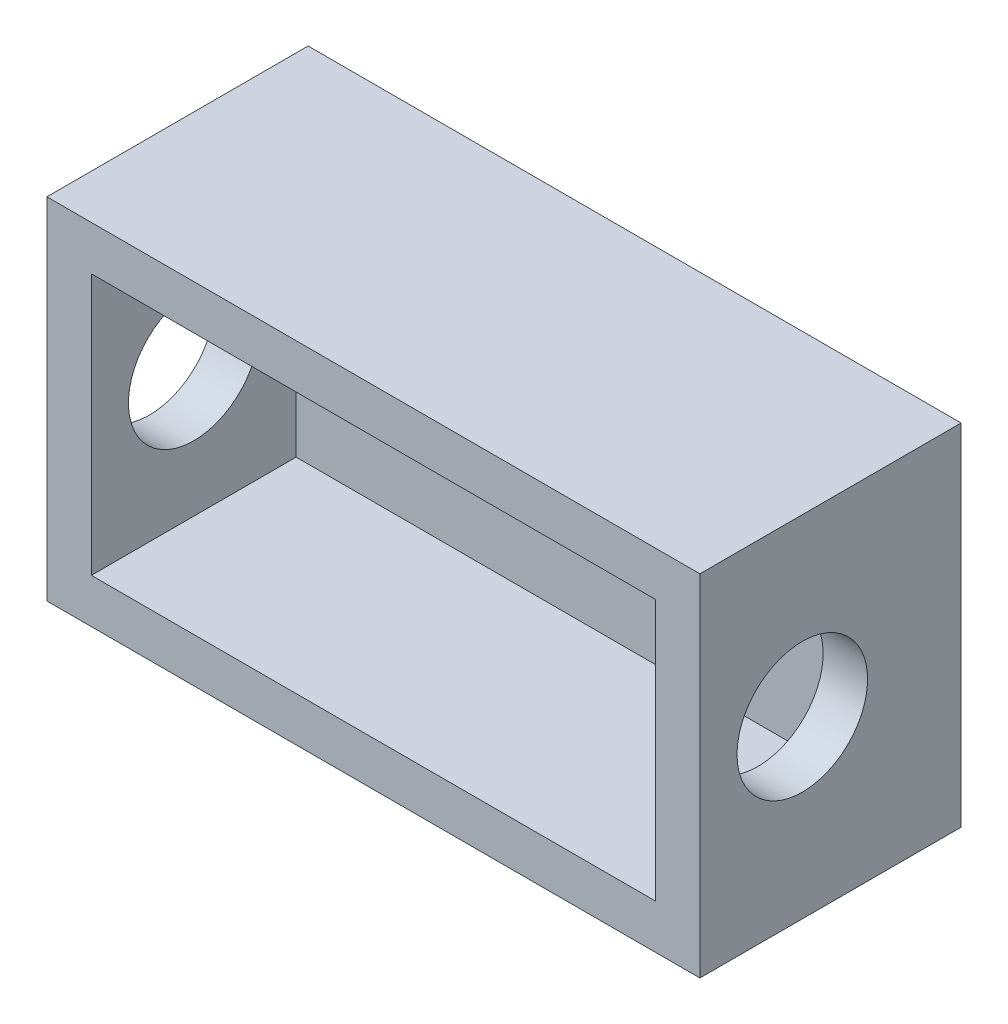
ISO-10303-21;
HEADER;
FILE_DESCRIPTION(('STEP AP214'),'2;1');
FILE_NAME('part.step','',(''),(''),'','','');
FILE_SCHEMA(('AUTOMOTIVE_DESIGN { 1 0 10303 214 1 1 1 1 }'));
ENDSEC;
DATA;
#1=APPLICATION_CONTEXT('core data for automotive mechanical design processes');
#2=APPLICATION_PROTOCOL_DEFINITION('international standard','automotive_design',2000,#1);
#3=PRODUCT_CONTEXT('',#1,'mechanical');
#4=PRODUCT('Part','Part','',(#3));
#5=PRODUCT_RELATED_PRODUCT_CATEGORY('part','',(#4));
#6=PRODUCT_DEFINITION_FORMATION('','',#4);
#7=PRODUCT_DEFINITION_CONTEXT('part definition',#1,'design');
#8=PRODUCT_DEFINITION('design','',#6,#7);
#9=PRODUCT_DEFINITION_SHAPE('','',#8);
#10=(LENGTH_UNIT() NAMED_UNIT(*) SI_UNIT(.MILLI.,.METRE.));
#11=(NAMED_UNIT(*) PLANE_ANGLE_UNIT() SI_UNIT($,.RADIAN.));
#12=(NAMED_UNIT(*) SI_UNIT($,.STERADIAN.) SOLID_ANGLE_UNIT());
#13=UNCERTAINTY_MEASURE_WITH_UNIT(LENGTH_MEASURE(1.E-05),#10,'distance_accuracy_value','');
#14=(GEOMETRIC_REPRESENTATION_CONTEXT(3) GLOBAL_UNCERTAINTY_ASSIGNED_CONTEXT((#13)) GLOBAL_UNIT_ASSIGNED_CONTEXT((#10,
#11,#12)) REPRESENTATION_CONTEXT('',''));
#15=CARTESIAN_POINT('',(0.,0.,0.));
#16=DIRECTION('',(0.,0.,1.));
#17=DIRECTION('',(1.,0.,0.));
#18=AXIS2_PLACEMENT_3D('',#15,#16,#17);
#19=CARTESIAN_POINT('',(-15.875,7.350000032,-3.425));
#20=DIRECTION('',(0.,-1.,0.));
#21=DIRECTION('',(0.,0.,-1.));
#22=AXIS2_PLACEMENT_3D('',#19,#20,#21);
#23=PLANE('',#22);
#24=DIRECTION('',(-1.,0.,0.));
#25=VECTOR('',#24,1.);
#26=CARTESIAN_POINT('',(-15.875,7.350000032,-14.95));
#27=LINE('',#26,#25);
#28=CARTESIAN_POINT('',(15.875,7.350000032,-14.95));
#29=VERTEX_POINT('',#28);
#30=CARTESIAN_POINT('',(-15.875,7.350000032,-14.95));
#31=VERTEX_POINT('',#30);
#32=EDGE_CURVE('E147',#29,#31,#27,.T.);
#33=ORIENTED_EDGE('',*,*,#32,.F.);
#34=DIRECTION('',(0.,0.,-1.));
#35=VECTOR('',#34,1.);
#36=CARTESIAN_POINT('',(15.875,7.350000032,-3.425));
#37=LINE('',#36,#35);
#38=CARTESIAN_POINT('',(15.875,7.350000032,-3.425));
#39=VERTEX_POINT('',#38);
#40=EDGE_CURVE('E159',#39,#29,#37,.T.);
#41=ORIENTED_EDGE('',*,*,#40,.F.);
#42=DIRECTION('',(-1.,0.,0.));
#43=VECTOR('',#42,1.);
#44=CARTESIAN_POINT('',(-15.875,7.350000032,-3.425));
#45=LINE('',#44,#43);
#46=CARTESIAN_POINT('',(-15.875,7.350000032,-3.425));
#47=VERTEX_POINT('',#46);
#48=EDGE_CURVE('E138',#39,#47,#45,.T.);
#49=ORIENTED_EDGE('',*,*,#48,.T.);
#50=DIRECTION('',(0.,0.,-1.));
#51=VECTOR('',#50,1.);
#52=CARTESIAN_POINT('',(-15.875,7.350000032,-3.425));
#53=LINE('',#52,#51);
#54=EDGE_CURVE('E157',#47,#31,#53,.T.);
#55=ORIENTED_EDGE('',*,*,#54,.T.);
#56=EDGE_LOOP('',(#33,#41,#49,#55));
#57=FACE_BOUND('',#56,.T.);
#58=ADVANCED_FACE('F36',(#57),#23,.T.);
#59=CARTESIAN_POINT('',(-15.875,-7.350000032,-3.425));
#60=DIRECTION('',(0.,1.,0.));
#61=DIRECTION('',(0.,0.,1.));
#62=AXIS2_PLACEMENT_3D('',#59,#60,#61);
#63=PLANE('',#62);
#64=DIRECTION('',(1.,0.,0.));
#65=VECTOR('',#64,1.);
#66=CARTESIAN_POINT('',(-15.875,-7.350000032,-14.95));
#67=LINE('',#66,#65);
#68=CARTESIAN_POINT('',(-15.875,-7.350000032,-14.95));
#69=VERTEX_POINT('',#68);
#70=CARTESIAN_POINT('',(15.875,-7.350000032,-14.95));
#71=VERTEX_POINT('',#70);
#72=EDGE_CURVE('E139',#69,#71,#67,.T.);
#73=ORIENTED_EDGE('',*,*,#72,.F.);
#74=DIRECTION('',(0.,0.,-1.));
#75=VECTOR('',#74,1.);
#76=CARTESIAN_POINT('',(-15.875,-7.350000032,-3.425));
#77=LINE('',#76,#75);
#78=CARTESIAN_POINT('',(-15.875,-7.350000032,-3.425));
#79=VERTEX_POINT('',#78);
#80=EDGE_CURVE('E53',#79,#69,#77,.T.);
#81=ORIENTED_EDGE('',*,*,#80,.F.);
#82=DIRECTION('',(1.,0.,0.));
#83=VECTOR('',#82,1.);
#84=CARTESIAN_POINT('',(-15.875,-7.350000032,-3.425));
#85=LINE('',#84,#83);
#86=CARTESIAN_POINT('',(15.875,-7.350000032,-3.425));
#87=VERTEX_POINT('',#86);
#88=EDGE_CURVE('E143',#79,#87,#85,.T.);
#89=ORIENTED_EDGE('',*,*,#88,.T.);
#90=DIRECTION('',(0.,0.,-1.));
#91=VECTOR('',#90,1.);
#92=CARTESIAN_POINT('',(15.875,-7.350000032,-3.425));
#93=LINE('',#92,#91);
#94=EDGE_CURVE('E145',#87,#71,#93,.T.);
#95=ORIENTED_EDGE('',*,*,#94,.T.);
#96=EDGE_LOOP('',(#73,#81,#89,#95));
#97=FACE_BOUND('',#96,.T.);
#98=ADVANCED_FACE('F198',(#97),#63,.T.);
#99=CARTESIAN_POINT('',(0.,0.,-14.95));
#100=DIRECTION('',(0.,0.,1.));
#101=DIRECTION('',(1.,0.,0.));
#102=AXIS2_PLACEMENT_3D('',#99,#100,#101);
#103=PLANE('',#102);
#104=DIRECTION('',(0.,-1.,0.));
#105=VECTOR('',#104,1.);
#106=CARTESIAN_POINT('',(-15.875,-7.350000032,-14.95));
#107=LINE('',#106,#105);
#108=EDGE_CURVE('E150',#31,#69,#107,.T.);
#109=ORIENTED_EDGE('',*,*,#108,.T.);
#110=ORIENTED_EDGE('',*,*,#72,.T.);
#111=DIRECTION('',(0.,1.,0.));
#112=VECTOR('',#111,1.);
#113=CARTESIAN_POINT('',(15.875,-7.350000032,-14.95));
#114=LINE('',#113,#112);
#115=EDGE_CURVE('E61',#71,#29,#114,.T.);
#116=ORIENTED_EDGE('',*,*,#115,.T.);
#117=ORIENTED_EDGE('',*,*,#32,.T.);
#118=EDGE_LOOP('',(#109,#110,#116,#117));
#119=FACE_BOUND('',#118,.T.);
#120=ADVANCED_FACE('F189',(#119),#103,.T.);
#121=CARTESIAN_POINT('',(0.,0.,-3.425));
#122=DIRECTION('',(0.,0.,-1.));
#123=DIRECTION('',(-1.,0.,0.));
#124=AXIS2_PLACEMENT_3D('',#121,#122,#123);
#125=PLANE('',#124);
#126=DIRECTION('',(0.,1.,0.));
#127=VECTOR('',#126,1.);
#128=CARTESIAN_POINT('',(18.375,-9.850000032,-3.425));
#129=LINE('',#128,#127);
#130=CARTESIAN_POINT('',(18.375,-9.850000032,-3.425));
#131=VERTEX_POINT('',#130);
#132=CARTESIAN_POINT('',(18.375,9.850000032,-3.425));
#133=VERTEX_POINT('',#132);
#134=EDGE_CURVE('E111',#131,#133,#129,.T.);
#135=ORIENTED_EDGE('',*,*,#134,.T.);
#136=DIRECTION('',(-1.,0.,0.));
#137=VECTOR('',#136,1.);
#138=CARTESIAN_POINT('',(-18.375,9.850000032,-3.425));
#139=LINE('',#138,#137);
#140=CARTESIAN_POINT('',(-18.375,9.850000032,-3.425));
#141=VERTEX_POINT('',#140);
#142=EDGE_CURVE('E162',#133,#141,#139,.T.);
#143=ORIENTED_EDGE('',*,*,#142,.T.);
#144=DIRECTION('',(0.,-1.,0.));
#145=VECTOR('',#144,1.);
#146=CARTESIAN_POINT('',(-18.375,-9.850000032,-3.425));
#147=LINE('',#146,#145);
#148=CARTESIAN_POINT('',(-18.375,-9.850000032,-3.425));
#149=VERTEX_POINT('',#148);
#150=EDGE_CURVE('E164',#141,#149,#147,.T.);
#151=ORIENTED_EDGE('',*,*,#150,.T.);
#152=DIRECTION('',(1.,0.,0.));
#153=VECTOR('',#152,1.);
#154=CARTESIAN_POINT('',(-18.375,-9.850000032,-3.425));
#155=LINE('',#154,#153);
#156=EDGE_CURVE('E115',#149,#131,#155,.T.);
#157=ORIENTED_EDGE('',*,*,#156,.T.);
#158=EDGE_LOOP('',(#135,#143,#151,#157));
#159=FACE_BOUND('',#158,.T.);
#160=DIRECTION('',(0.,1.,0.));
#161=VECTOR('',#160,1.);
#162=CARTESIAN_POINT('',(15.875,-7.350000032,-3.425));
#163=LINE('',#162,#161);
#164=EDGE_CURVE('E136',#87,#39,#163,.T.);
#165=ORIENTED_EDGE('',*,*,#164,.F.);
#166=ORIENTED_EDGE('',*,*,#88,.F.);
#167=DIRECTION('',(0.,-1.,0.));
#168=VECTOR('',#167,1.);
#169=CARTESIAN_POINT('',(-15.875,-7.350000032,-3.425));
#170=LINE('',#169,#168);
#171=EDGE_CURVE('E141',#47,#79,#170,.T.);
#172=ORIENTED_EDGE('',*,*,#171,.F.);
#173=ORIENTED_EDGE('',*,*,#48,.F.);
#174=EDGE_LOOP('',(#165,#166,#172,#173));
#175=FACE_BOUND('',#174,.T.);
#176=ADVANCED_FACE('F197',(#159,#175),#125,.F.);
#177=CARTESIAN_POINT('',(-18.375,9.850000032,-3.425));
#178=DIRECTION('',(0.,-1.,0.));
#179=DIRECTION('',(0.,0.,-1.));
#180=AXIS2_PLACEMENT_3D('',#177,#178,#179);
#181=PLANE('',#180);
#182=DIRECTION('',(0.,0.,-1.));
#183=VECTOR('',#182,1.);
#184=CARTESIAN_POINT('',(18.375,9.850000032,-3.425));
#185=LINE('',#184,#183);
#186=CARTESIAN_POINT('',(18.375,9.850000032,-18.125));
#187=VERTEX_POINT('',#186);
#188=EDGE_CURVE('E11',#133,#187,#185,.T.);
#189=ORIENTED_EDGE('',*,*,#188,.T.);
#190=DIRECTION('',(1.,0.,0.));
#191=VECTOR('',#190,1.);
#192=CARTESIAN_POINT('',(-18.375,9.850000032,-18.125));
#193=LINE('',#192,#191);
#194=CARTESIAN_POINT('',(-18.375,9.850000032,-18.125));
#195=VERTEX_POINT('',#194);
#196=EDGE_CURVE('E129',#195,#187,#193,.T.);
#197=ORIENTED_EDGE('',*,*,#196,.F.);
#198=DIRECTION('',(0.,0.,-1.));
#199=VECTOR('',#198,1.);
#200=CARTESIAN_POINT('',(-18.375,9.850000032,-3.425));
#201=LINE('',#200,#199);
#202=EDGE_CURVE('E45',#141,#195,#201,.T.);
#203=ORIENTED_EDGE('',*,*,#202,.F.);
#204=ORIENTED_EDGE('',*,*,#142,.F.);
#205=EDGE_LOOP('',(#189,#197,#203,#204));
#206=FACE_BOUND('',#205,.T.);
#207=ADVANCED_FACE('F235',(#206),#181,.F.);
#208=CARTESIAN_POINT('',(0.,0.,-18.125));
#209=DIRECTION('',(0.,0.,1.));
#210=DIRECTION('',(1.,0.,0.));
#211=AXIS2_PLACEMENT_3D('',#208,#209,#210);
#212=PLANE('',#211);
#213=DIRECTION('',(0.,-1.,0.));
#214=VECTOR('',#213,1.);
#215=CARTESIAN_POINT('',(18.375,9.850000032,-18.125));
#216=LINE('',#215,#214);
#217=CARTESIAN_POINT('',(18.375,-9.850000032,-18.125));
#218=VERTEX_POINT('',#217);
#219=EDGE_CURVE('E109',#187,#218,#216,.T.);
#220=ORIENTED_EDGE('',*,*,#219,.T.);
#221=DIRECTION('',(-1.,0.,0.));
#222=VECTOR('',#221,1.);
#223=CARTESIAN_POINT('',(-18.375,-9.850000032,-18.125));
#224=LINE('',#223,#222);
#225=CARTESIAN_POINT('',(-18.375,-9.850000032,-18.125));
#226=VERTEX_POINT('',#225);
#227=EDGE_CURVE('E118',#218,#226,#224,.T.);
#228=ORIENTED_EDGE('',*,*,#227,.T.);
#229=DIRECTION('',(0.,1.,0.));
#230=VECTOR('',#229,1.);
#231=CARTESIAN_POINT('',(-18.375,9.850000032,-18.125));
#232=LINE('',#231,#230);
#233=EDGE_CURVE('E124',#226,#195,#232,.T.);
#234=ORIENTED_EDGE('',*,*,#233,.T.);
#235=ORIENTED_EDGE('',*,*,#196,.T.);
#236=EDGE_LOOP('',(#220,#228,#234,#235));
#237=FACE_BOUND('',#236,.T.);
#238=ADVANCED_FACE('F127',(#237),#212,.F.);
#239=CARTESIAN_POINT('',(-18.375,-9.850000032,-3.425));
#240=DIRECTION('',(0.,1.,0.));
#241=DIRECTION('',(0.,0.,1.));
#242=AXIS2_PLACEMENT_3D('',#239,#240,#241);
#243=PLANE('',#242);
#244=DIRECTION('',(0.,0.,-1.));
#245=VECTOR('',#244,1.);
#246=CARTESIAN_POINT('',(-18.375,-9.850000032,-3.425));
#247=LINE('',#246,#245);
#248=EDGE_CURVE('E114',#149,#226,#247,.T.);
#249=ORIENTED_EDGE('',*,*,#248,.T.);
#250=ORIENTED_EDGE('',*,*,#227,.F.);
#251=DIRECTION('',(0.,0.,-1.));
#252=VECTOR('',#251,1.);
#253=CARTESIAN_POINT('',(18.375,-9.850000032,-3.425));
#254=LINE('',#253,#252);
#255=EDGE_CURVE('E105',#131,#218,#254,.T.);
#256=ORIENTED_EDGE('',*,*,#255,.F.);
#257=ORIENTED_EDGE('',*,*,#156,.F.);
#258=EDGE_LOOP('',(#249,#250,#256,#257));
#259=FACE_BOUND('',#258,.T.);
#260=ADVANCED_FACE('F119',(#259),#243,.F.);
#261=CARTESIAN_POINT('',(18.375,-9.850000032,-3.425));
#262=DIRECTION('',(-1.,0.,0.));
#263=DIRECTION('',(0.,0.,1.));
#264=AXIS2_PLACEMENT_3D('',#261,#262,#263);
#265=PLANE('',#264);
#266=CARTESIAN_POINT('',(18.375,0.,-9.18750000000001));
#267=DIRECTION('',(-1.,0.,0.));
#268=DIRECTION('',(0.,0.,1.));
#269=AXIS2_PLACEMENT_3D('',#266,#267,#268);
#270=CIRCLE('',#269,3.675);
#271=CARTESIAN_POINT('',(18.375,0.,-5.51250000000001));
#272=VERTEX_POINT('',#271);
#273=EDGE_CURVE('E172',#272,#272,#270,.T.);
#274=ORIENTED_EDGE('',*,*,#273,.T.);
#275=EDGE_LOOP('',(#274));
#276=FACE_BOUND('',#275,.T.);
#277=ORIENTED_EDGE('',*,*,#255,.T.);
#278=ORIENTED_EDGE('',*,*,#219,.F.);
#279=ORIENTED_EDGE('',*,*,#188,.F.);
#280=ORIENTED_EDGE('',*,*,#134,.F.);
#281=EDGE_LOOP('',(#277,#278,#279,#280));
#282=FACE_BOUND('',#281,.T.);
#283=ADVANCED_FACE('F38',(#276,#282),#265,.F.);
#284=CARTESIAN_POINT('',(15.875,-7.350000032,-3.425));
#285=DIRECTION('',(-1.,0.,0.));
#286=DIRECTION('',(0.,0.,1.));
#287=AXIS2_PLACEMENT_3D('',#284,#285,#286);
#288=PLANE('',#287);
#289=CARTESIAN_POINT('',(15.875,0.,-9.18750000000001));
#290=DIRECTION('',(-1.,0.,0.));
#291=DIRECTION('',(0.,0.,1.));
#292=AXIS2_PLACEMENT_3D('',#289,#290,#291);
#293=CIRCLE('',#292,3.675);
#294=CARTESIAN_POINT('',(15.875,0.,-5.51250000000001));
#295=VERTEX_POINT('',#294);
#296=EDGE_CURVE('E132',#295,#295,#293,.T.);
#297=ORIENTED_EDGE('',*,*,#296,.F.);
#298=EDGE_LOOP('',(#297));
#299=FACE_BOUND('',#298,.T.);
#300=ORIENTED_EDGE('',*,*,#115,.F.);
#301=ORIENTED_EDGE('',*,*,#94,.F.);
#302=ORIENTED_EDGE('',*,*,#164,.T.);
#303=ORIENTED_EDGE('',*,*,#40,.T.);
#304=EDGE_LOOP('',(#300,#301,#302,#303));
#305=FACE_BOUND('',#304,.T.);
#306=ADVANCED_FACE('F193',(#299,#305),#288,.T.);
#307=CARTESIAN_POINT('',(18.375,0.,-9.18750000000001));
#308=DIRECTION('',(-1.,0.,0.));
#309=DIRECTION('',(0.,0.,1.));
#310=AXIS2_PLACEMENT_3D('',#307,#308,#309);
#311=CYLINDRICAL_SURFACE('',#310,3.675);
#312=ORIENTED_EDGE('',*,*,#273,.F.);
#313=EDGE_LOOP('',(#312));
#314=FACE_BOUND('',#313,.T.);
#315=ORIENTED_EDGE('',*,*,#296,.T.);
#316=EDGE_LOOP('',(#315));
#317=FACE_BOUND('',#316,.T.);
#318=ADVANCED_FACE('F209',(#314,#317),#311,.F.);
#319=CARTESIAN_POINT('',(-18.375,-9.850000032,-3.425));
#320=DIRECTION('',(1.,0.,0.));
#321=DIRECTION('',(0.,0.,-1.));
#322=AXIS2_PLACEMENT_3D('',#319,#320,#321);
#323=PLANE('',#322);
#324=CARTESIAN_POINT('',(-18.375,0.,-9.18750000000001));
#325=DIRECTION('',(1.,0.,0.));
#326=DIRECTION('',(0.,0.,-1.));
#327=AXIS2_PLACEMENT_3D('',#324,#325,#326);
#328=CIRCLE('',#327,3.675);
#329=CARTESIAN_POINT('',(-18.375,0.,-12.8625));
#330=VERTEX_POINT('',#329);
#331=EDGE_CURVE('E40',#330,#330,#328,.T.);
#332=ORIENTED_EDGE('',*,*,#331,.T.);
#333=EDGE_LOOP('',(#332));
#334=FACE_BOUND('',#333,.T.);
#335=ORIENTED_EDGE('',*,*,#202,.T.);
#336=ORIENTED_EDGE('',*,*,#233,.F.);
#337=ORIENTED_EDGE('',*,*,#248,.F.);
#338=ORIENTED_EDGE('',*,*,#150,.F.);
#339=EDGE_LOOP('',(#335,#336,#337,#338));
#340=FACE_BOUND('',#339,.T.);
#341=ADVANCED_FACE('F183',(#334,#340),#323,.F.);
#342=CARTESIAN_POINT('',(-15.875,-7.350000032,-3.425));
#343=DIRECTION('',(1.,0.,0.));
#344=DIRECTION('',(0.,0.,-1.));
#345=AXIS2_PLACEMENT_3D('',#342,#343,#344);
#346=PLANE('',#345);
#347=CARTESIAN_POINT('',(-15.875,0.,-9.18750000000001));
#348=DIRECTION('',(1.,0.,0.));
#349=DIRECTION('',(0.,0.,-1.));
#350=AXIS2_PLACEMENT_3D('',#347,#348,#349);
#351=CIRCLE('',#350,3.675);
#352=CARTESIAN_POINT('',(-15.875,0.,-12.8625));
#353=VERTEX_POINT('',#352);
#354=EDGE_CURVE('E171',#353,#353,#351,.T.);
#355=ORIENTED_EDGE('',*,*,#354,.F.);
#356=EDGE_LOOP('',(#355));
#357=FACE_BOUND('',#356,.T.);
#358=ORIENTED_EDGE('',*,*,#108,.F.);
#359=ORIENTED_EDGE('',*,*,#54,.F.);
#360=ORIENTED_EDGE('',*,*,#171,.T.);
#361=ORIENTED_EDGE('',*,*,#80,.T.);
#362=EDGE_LOOP('',(#358,#359,#360,#361));
#363=FACE_BOUND('',#362,.T.);
#364=ADVANCED_FACE('F180',(#357,#363),#346,.T.);
#365=ORIENTED_EDGE('',*,*,#354,.T.);
#366=EDGE_LOOP('',(#365));
#367=FACE_BOUND('',#366,.T.);
#368=ORIENTED_EDGE('',*,*,#331,.F.);
#369=EDGE_LOOP('',(#368));
#370=FACE_BOUND('',#369,.T.);
#371=ADVANCED_FACE('F177',(#367,#370),#311,.F.);
#372=CLOSED_SHELL('',(#58,#98,#120,#176,#207,#238,#260,#283,#306,#318,#341,#364,#371));
#373=MANIFOLD_SOLID_BREP('B2',#372);
#374=ADVANCED_BREP_SHAPE_REPRESENTATION('',(#18,#373),#14);
#375=SHAPE_DEFINITION_REPRESENTATION(#9,#374);
ENDSEC;
END-ISO-10303-21;
